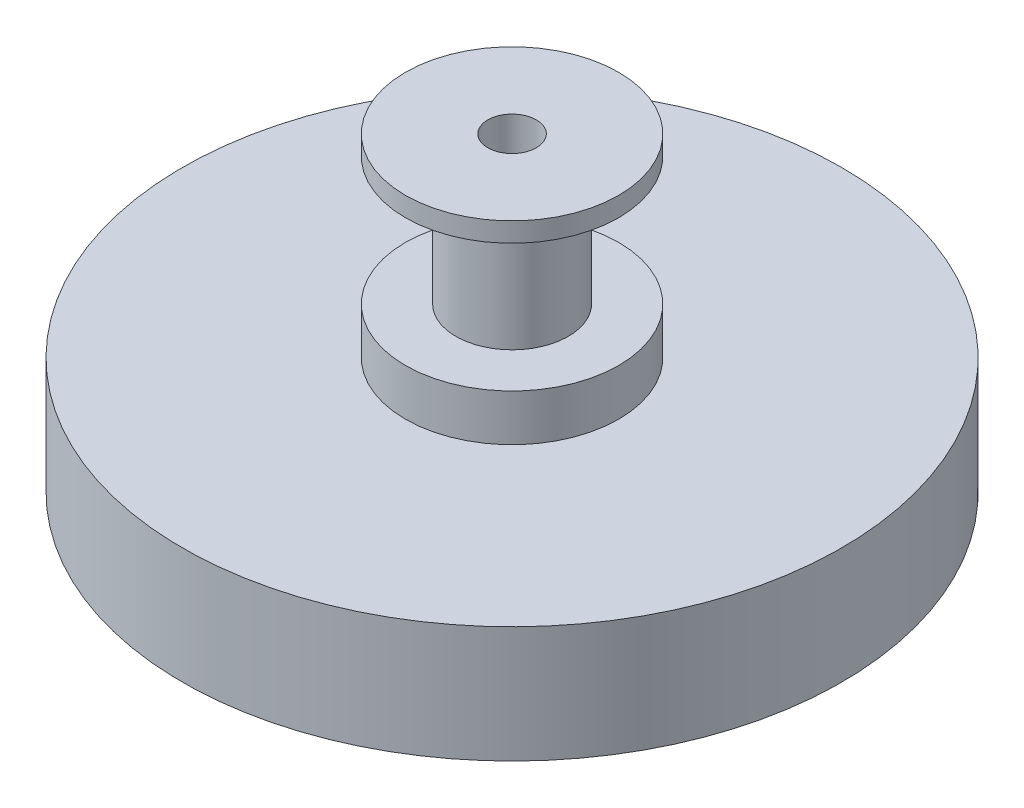
ISO-10303-21;
HEADER;
FILE_DESCRIPTION(('STEP AP214'),'2;1');
FILE_NAME('part.step','',(''),(''),'','','');
FILE_SCHEMA(('AUTOMOTIVE_DESIGN { 1 0 10303 214 1 1 1 1 }'));
ENDSEC;
DATA;
#1=APPLICATION_CONTEXT('core data for automotive mechanical design processes');
#2=APPLICATION_PROTOCOL_DEFINITION('international standard','automotive_design',2000,#1);
#3=PRODUCT_CONTEXT('',#1,'mechanical');
#4=PRODUCT('Part','Part','',(#3));
#5=PRODUCT_RELATED_PRODUCT_CATEGORY('part','',(#4));
#6=PRODUCT_DEFINITION_FORMATION('','',#4);
#7=PRODUCT_DEFINITION_CONTEXT('part definition',#1,'design');
#8=PRODUCT_DEFINITION('design','',#6,#7);
#9=PRODUCT_DEFINITION_SHAPE('','',#8);
#10=(LENGTH_UNIT() NAMED_UNIT(*) SI_UNIT(.MILLI.,.METRE.));
#11=(NAMED_UNIT(*) PLANE_ANGLE_UNIT() SI_UNIT($,.RADIAN.));
#12=(NAMED_UNIT(*) SI_UNIT($,.STERADIAN.) SOLID_ANGLE_UNIT());
#13=UNCERTAINTY_MEASURE_WITH_UNIT(LENGTH_MEASURE(1.E-05),#10,'distance_accuracy_value','');
#14=(GEOMETRIC_REPRESENTATION_CONTEXT(3) GLOBAL_UNCERTAINTY_ASSIGNED_CONTEXT((#13)) GLOBAL_UNIT_ASSIGNED_CONTEXT((#10,
#11,#12)) REPRESENTATION_CONTEXT('',''));
#15=CARTESIAN_POINT('',(0.,0.,0.));
#16=DIRECTION('',(0.,0.,1.));
#17=DIRECTION('',(1.,0.,0.));
#18=AXIS2_PLACEMENT_3D('',#15,#16,#17);
#19=CARTESIAN_POINT('',(0.,52.712292696646,27.5));
#20=DIRECTION('',(0.,-1.,0.));
#21=DIRECTION('',(0.,0.,-1.));
#22=AXIS2_PLACEMENT_3D('',#19,#20,#21);
#23=PLANE('',#22);
#24=CARTESIAN_POINT('',(0.,52.7122926966461,1.80816289251647E-13));
#25=DIRECTION('',(0.,-1.,0.));
#26=DIRECTION('',(0.,0.,-1.));
#27=AXIS2_PLACEMENT_3D('',#24,#25,#26);
#28=CIRCLE('',#27,27.4999999999998);
#29=CARTESIAN_POINT('',(0.,52.7122926966462,-27.4999999999996));
#30=VERTEX_POINT('',#29);
#31=EDGE_CURVE('E10',#30,#30,#28,.T.);
#32=ORIENTED_EDGE('',*,*,#31,.F.);
#33=EDGE_LOOP('',(#32));
#34=FACE_BOUND('',#33,.T.);
#35=CARTESIAN_POINT('',(0.,52.7122926966461,1.80816289251647E-13));
#36=DIRECTION('',(0.,-1.,0.));
#37=DIRECTION('',(0.,0.,-1.));
#38=AXIS2_PLACEMENT_3D('',#35,#36,#37);
#39=CIRCLE('',#38,14.4999999999998);
#40=CARTESIAN_POINT('',(0.,52.7122926966462,-14.4999999999996));
#41=VERTEX_POINT('',#40);
#42=EDGE_CURVE('E69',#41,#41,#39,.T.);
#43=ORIENTED_EDGE('',*,*,#42,.T.);
#44=EDGE_LOOP('',(#43));
#45=FACE_BOUND('',#44,.T.);
#46=ADVANCED_FACE('F35',(#34,#45),#23,.F.);
#47=CARTESIAN_POINT('',(0.,-5577.83915172928,-1.91333771661652E-11));
#48=DIRECTION('',(0.,-1.,0.));
#49=DIRECTION('',(0.,0.,-1.));
#50=AXIS2_PLACEMENT_3D('',#47,#48,#49);
#51=CYLINDRICAL_SURFACE('',#50,27.4999999999998);
#52=CARTESIAN_POINT('',(0.,40.7122926966457,1.39653301265017E-13));
#53=DIRECTION('',(0.,-1.,0.));
#54=DIRECTION('',(0.,0.,-1.));
#55=AXIS2_PLACEMENT_3D('',#52,#53,#54);
#56=CIRCLE('',#55,27.4999999999998);
#57=CARTESIAN_POINT('',(0.,40.7122926966458,-27.4999999999997));
#58=VERTEX_POINT('',#57);
#59=EDGE_CURVE('E41',#58,#58,#56,.T.);
#60=ORIENTED_EDGE('',*,*,#59,.F.);
#61=EDGE_LOOP('',(#60));
#62=FACE_BOUND('',#61,.T.);
#63=ORIENTED_EDGE('',*,*,#31,.T.);
#64=EDGE_LOOP('',(#63));
#65=FACE_BOUND('',#64,.T.);
#66=ADVANCED_FACE('F118',(#62,#65),#51,.T.);
#67=CARTESIAN_POINT('',(0.,40.7122926966461,27.5));
#68=DIRECTION('',(0.,-1.,0.));
#69=DIRECTION('',(0.,0.,-1.));
#70=AXIS2_PLACEMENT_3D('',#67,#68,#69);
#71=PLANE('',#70);
#72=CARTESIAN_POINT('',(0.,40.7122926966457,1.39653301265017E-13));
#73=DIRECTION('',(0.,-1.,0.));
#74=DIRECTION('',(0.,0.,-1.));
#75=AXIS2_PLACEMENT_3D('',#72,#73,#74);
#76=CIRCLE('',#75,84.9999999999999);
#77=CARTESIAN_POINT('',(0.,40.712292696646,-84.9999999999997));
#78=VERTEX_POINT('',#77);
#79=EDGE_CURVE('E45',#78,#78,#76,.T.);
#80=ORIENTED_EDGE('',*,*,#79,.F.);
#81=EDGE_LOOP('',(#80));
#82=FACE_BOUND('',#81,.T.);
#83=ORIENTED_EDGE('',*,*,#59,.T.);
#84=EDGE_LOOP('',(#83));
#85=FACE_BOUND('',#84,.T.);
#86=ADVANCED_FACE('F113',(#82,#85),#71,.F.);
#87=CARTESIAN_POINT('',(0.,-5577.83915172928,-1.91333771661652E-11));
#88=DIRECTION('',(0.,-1.,0.));
#89=DIRECTION('',(0.,0.,-1.));
#90=AXIS2_PLACEMENT_3D('',#87,#88,#89);
#91=CYLINDRICAL_SURFACE('',#90,84.9999999999999);
#92=CARTESIAN_POINT('',(0.,10.7122926966463,0.));
#93=DIRECTION('',(0.,-1.,0.));
#94=DIRECTION('',(0.,0.,-1.));
#95=AXIS2_PLACEMENT_3D('',#92,#93,#94);
#96=CIRCLE('',#95,85.);
#97=CARTESIAN_POINT('',(0.,10.7122926966466,-84.9999999999999));
#98=VERTEX_POINT('',#97);
#99=EDGE_CURVE('E49',#98,#98,#96,.T.);
#100=ORIENTED_EDGE('',*,*,#99,.F.);
#101=EDGE_LOOP('',(#100));
#102=FACE_BOUND('',#101,.T.);
#103=ORIENTED_EDGE('',*,*,#79,.T.);
#104=EDGE_LOOP('',(#103));
#105=FACE_BOUND('',#104,.T.);
#106=ADVANCED_FACE('F107',(#102,#105),#91,.T.);
#107=CARTESIAN_POINT('',(0.,10.712292696646,85.));
#108=DIRECTION('',(0.,1.,0.));
#109=DIRECTION('',(0.,0.,1.));
#110=AXIS2_PLACEMENT_3D('',#107,#108,#109);
#111=PLANE('',#110);
#112=CARTESIAN_POINT('',(0.,10.7122926966463,0.));
#113=DIRECTION('',(0.,-1.,0.));
#114=DIRECTION('',(0.,0.,-1.));
#115=AXIS2_PLACEMENT_3D('',#112,#113,#114);
#116=CIRCLE('',#115,6.24999999999996);
#117=CARTESIAN_POINT('',(0.,10.7122926966463,-6.24999999999993));
#118=VERTEX_POINT('',#117);
#119=EDGE_CURVE('E54',#118,#118,#116,.T.);
#120=ORIENTED_EDGE('',*,*,#119,.F.);
#121=EDGE_LOOP('',(#120));
#122=FACE_BOUND('',#121,.T.);
#123=ORIENTED_EDGE('',*,*,#99,.T.);
#124=EDGE_LOOP('',(#123));
#125=FACE_BOUND('',#124,.T.);
#126=ADVANCED_FACE('F101',(#122,#125),#111,.F.);
#127=CARTESIAN_POINT('',(0.,-5577.83915172928,-1.91333771661652E-11));
#128=DIRECTION('',(0.,-1.,0.));
#129=DIRECTION('',(0.,0.,-1.));
#130=AXIS2_PLACEMENT_3D('',#127,#128,#129);
#131=CYLINDRICAL_SURFACE('',#130,6.24999999999983);
#132=CARTESIAN_POINT('',(0.,90.7122926966464,3.11165751209305E-13));
#133=DIRECTION('',(0.,-1.,0.));
#134=DIRECTION('',(0.,0.,-1.));
#135=AXIS2_PLACEMENT_3D('',#132,#133,#134);
#136=CIRCLE('',#135,6.24999999999969);
#137=CARTESIAN_POINT('',(0.,90.7122926966464,-6.24999999999938));
#138=VERTEX_POINT('',#137);
#139=EDGE_CURVE('E57',#138,#138,#136,.T.);
#140=ORIENTED_EDGE('',*,*,#139,.F.);
#141=EDGE_LOOP('',(#140));
#142=FACE_BOUND('',#141,.T.);
#143=ORIENTED_EDGE('',*,*,#119,.T.);
#144=EDGE_LOOP('',(#143));
#145=FACE_BOUND('',#144,.T.);
#146=ADVANCED_FACE('F95',(#142,#145),#131,.F.);
#147=CARTESIAN_POINT('',(0.,90.7122926966459,27.5));
#148=DIRECTION('',(0.,-1.,0.));
#149=DIRECTION('',(0.,0.,-1.));
#150=AXIS2_PLACEMENT_3D('',#147,#148,#149);
#151=PLANE('',#150);
#152=CARTESIAN_POINT('',(0.,90.7122926966464,3.11165751209305E-13));
#153=DIRECTION('',(0.,-1.,0.));
#154=DIRECTION('',(0.,0.,-1.));
#155=AXIS2_PLACEMENT_3D('',#152,#153,#154);
#156=CIRCLE('',#155,27.4999999999997);
#157=CARTESIAN_POINT('',(0.,90.7122926966465,-27.4999999999994));
#158=VERTEX_POINT('',#157);
#159=EDGE_CURVE('E60',#158,#158,#156,.T.);
#160=ORIENTED_EDGE('',*,*,#159,.F.);
#161=EDGE_LOOP('',(#160));
#162=FACE_BOUND('',#161,.T.);
#163=ORIENTED_EDGE('',*,*,#139,.T.);
#164=EDGE_LOOP('',(#163));
#165=FACE_BOUND('',#164,.T.);
#166=ADVANCED_FACE('F89',(#162,#165),#151,.F.);
#167=CARTESIAN_POINT('',(0.,-5577.83915172928,-1.91333771661652E-11));
#168=DIRECTION('',(0.,-1.,0.));
#169=DIRECTION('',(0.,0.,-1.));
#170=AXIS2_PLACEMENT_3D('',#167,#168,#169);
#171=CYLINDRICAL_SURFACE('',#170,27.4999999999997);
#172=CARTESIAN_POINT('',(0.,85.7122926966456,2.94014506214874E-13));
#173=DIRECTION('',(0.,-1.,0.));
#174=DIRECTION('',(0.,0.,-1.));
#175=AXIS2_PLACEMENT_3D('',#172,#173,#174);
#176=CIRCLE('',#175,27.4999999999997);
#177=CARTESIAN_POINT('',(0.,85.7122926966457,-27.4999999999994));
#178=VERTEX_POINT('',#177);
#179=EDGE_CURVE('E63',#178,#178,#176,.T.);
#180=ORIENTED_EDGE('',*,*,#179,.F.);
#181=EDGE_LOOP('',(#180));
#182=FACE_BOUND('',#181,.T.);
#183=ORIENTED_EDGE('',*,*,#159,.T.);
#184=EDGE_LOOP('',(#183));
#185=FACE_BOUND('',#184,.T.);
#186=ADVANCED_FACE('F83',(#182,#185),#171,.T.);
#187=CARTESIAN_POINT('',(0.,85.712292696646,14.5));
#188=DIRECTION('',(0.,1.,0.));
#189=DIRECTION('',(0.,0.,1.));
#190=AXIS2_PLACEMENT_3D('',#187,#188,#189);
#191=PLANE('',#190);
#192=CARTESIAN_POINT('',(0.,85.7122926966456,2.94014506214874E-13));
#193=DIRECTION('',(0.,-1.,0.));
#194=DIRECTION('',(0.,0.,-1.));
#195=AXIS2_PLACEMENT_3D('',#192,#193,#194);
#196=CIRCLE('',#195,14.4999999999997);
#197=CARTESIAN_POINT('',(0.,85.7122926966456,-14.4999999999994));
#198=VERTEX_POINT('',#197);
#199=EDGE_CURVE('E66',#198,#198,#196,.T.);
#200=ORIENTED_EDGE('',*,*,#199,.F.);
#201=EDGE_LOOP('',(#200));
#202=FACE_BOUND('',#201,.T.);
#203=ORIENTED_EDGE('',*,*,#179,.T.);
#204=EDGE_LOOP('',(#203));
#205=FACE_BOUND('',#204,.T.);
#206=ADVANCED_FACE('F77',(#202,#205),#191,.F.);
#207=CARTESIAN_POINT('',(0.,-5577.83915172928,-1.91333771661652E-11));
#208=DIRECTION('',(0.,-1.,0.));
#209=DIRECTION('',(0.,0.,-1.));
#210=AXIS2_PLACEMENT_3D('',#207,#208,#209);
#211=CYLINDRICAL_SURFACE('',#210,14.4999999999997);
#212=ORIENTED_EDGE('',*,*,#42,.F.);
#213=EDGE_LOOP('',(#212));
#214=FACE_BOUND('',#213,.T.);
#215=ORIENTED_EDGE('',*,*,#199,.T.);
#216=EDGE_LOOP('',(#215));
#217=FACE_BOUND('',#216,.T.);
#218=ADVANCED_FACE('F74',(#214,#217),#211,.T.);
#219=CLOSED_SHELL('',(#46,#66,#86,#106,#126,#146,#166,#186,#206,#218));
#220=MANIFOLD_SOLID_BREP('B2',#219);
#221=ADVANCED_BREP_SHAPE_REPRESENTATION('',(#18,#220),#14);
#222=SHAPE_DEFINITION_REPRESENTATION(#9,#221);
ENDSEC;
END-ISO-10303-21;
